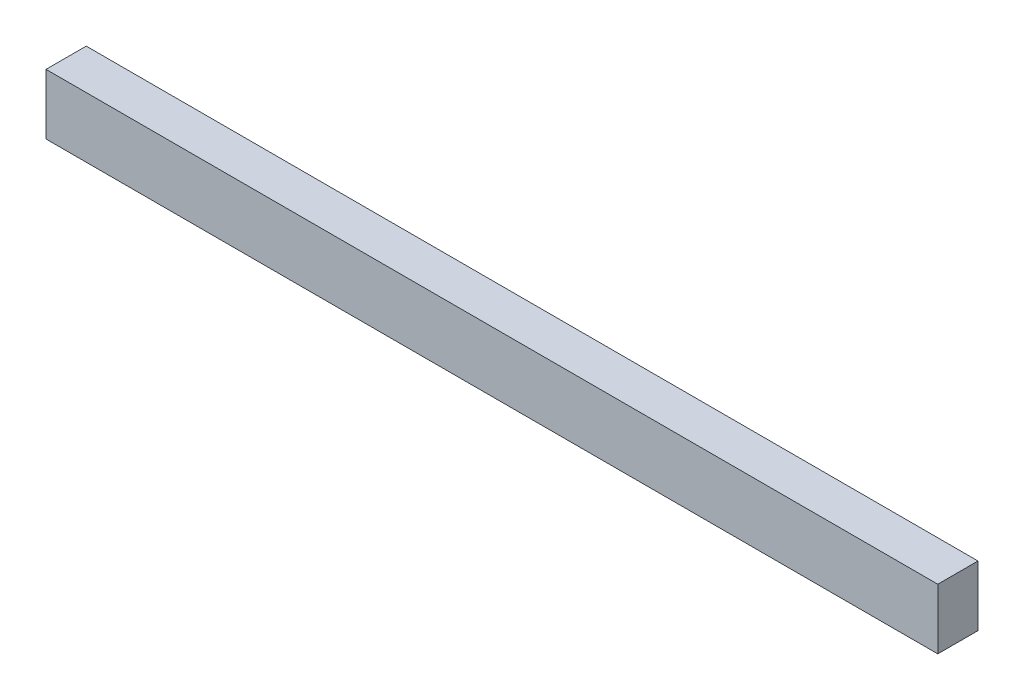
ISO-10303-21;
HEADER;
FILE_DESCRIPTION(('STEP AP214'),'2;1');
FILE_NAME('part.step','',(''),(''),'','','');
FILE_SCHEMA(('AUTOMOTIVE_DESIGN { 1 0 10303 214 1 1 1 1 }'));
ENDSEC;
DATA;
#1=APPLICATION_CONTEXT('core data for automotive mechanical design processes');
#2=APPLICATION_PROTOCOL_DEFINITION('international standard','automotive_design',2000,#1);
#3=PRODUCT_CONTEXT('',#1,'mechanical');
#4=PRODUCT('Part','Part','',(#3));
#5=PRODUCT_RELATED_PRODUCT_CATEGORY('part','',(#4));
#6=PRODUCT_DEFINITION_FORMATION('','',#4);
#7=PRODUCT_DEFINITION_CONTEXT('part definition',#1,'design');
#8=PRODUCT_DEFINITION('design','',#6,#7);
#9=PRODUCT_DEFINITION_SHAPE('','',#8);
#10=(LENGTH_UNIT() NAMED_UNIT(*) SI_UNIT(.MILLI.,.METRE.));
#11=(NAMED_UNIT(*) PLANE_ANGLE_UNIT() SI_UNIT($,.RADIAN.));
#12=(NAMED_UNIT(*) SI_UNIT($,.STERADIAN.) SOLID_ANGLE_UNIT());
#13=UNCERTAINTY_MEASURE_WITH_UNIT(LENGTH_MEASURE(1.E-05),#10,'distance_accuracy_value','');
#14=(GEOMETRIC_REPRESENTATION_CONTEXT(3) GLOBAL_UNCERTAINTY_ASSIGNED_CONTEXT((#13)) GLOBAL_UNIT_ASSIGNED_CONTEXT((#10,
#11,#12)) REPRESENTATION_CONTEXT('',''));
#15=CARTESIAN_POINT('',(0.,0.,0.));
#16=DIRECTION('',(0.,0.,1.));
#17=DIRECTION('',(1.,0.,0.));
#18=AXIS2_PLACEMENT_3D('',#15,#16,#17);
#19=CARTESIAN_POINT('',(-168.319409066419,27.,-67.9761376248613));
#20=DIRECTION('',(1.,0.,0.));
#21=DIRECTION('',(0.,0.,-1.));
#22=AXIS2_PLACEMENT_3D('',#19,#20,#21);
#23=PLANE('',#22);
#24=DIRECTION('',(0.,0.,1.));
#25=VECTOR('',#24,1.);
#26=CARTESIAN_POINT('',(-168.319409066419,0.,-67.9761376248613));
#27=LINE('',#26,#25);
#28=CARTESIAN_POINT('',(-168.319409066419,0.,-67.9761376248613));
#29=VERTEX_POINT('',#28);
#30=CARTESIAN_POINT('',(-168.319409066419,0.,-49.9761376248613));
#31=VERTEX_POINT('',#30);
#32=EDGE_CURVE('E109',#29,#31,#27,.T.);
#33=ORIENTED_EDGE('',*,*,#32,.T.);
#34=DIRECTION('',(0.,-1.,0.));
#35=VECTOR('',#34,1.);
#36=CARTESIAN_POINT('',(-168.319409066419,27.,-49.9761376248613));
#37=LINE('',#36,#35);
#38=CARTESIAN_POINT('',(-168.319409066419,27.,-49.9761376248613));
#39=VERTEX_POINT('',#38);
#40=EDGE_CURVE('E11',#39,#31,#37,.T.);
#41=ORIENTED_EDGE('',*,*,#40,.F.);
#42=DIRECTION('',(0.,0.,1.));
#43=VECTOR('',#42,1.);
#44=CARTESIAN_POINT('',(-168.319409066419,27.,-67.9761376248613));
#45=LINE('',#44,#43);
#46=CARTESIAN_POINT('',(-168.319409066419,27.,-67.9761376248613));
#47=VERTEX_POINT('',#46);
#48=EDGE_CURVE('E93',#47,#39,#45,.T.);
#49=ORIENTED_EDGE('',*,*,#48,.F.);
#50=DIRECTION('',(0.,-1.,0.));
#51=VECTOR('',#50,1.);
#52=CARTESIAN_POINT('',(-168.319409066419,27.,-67.9761376248613));
#53=LINE('',#52,#51);
#54=EDGE_CURVE('E105',#47,#29,#53,.T.);
#55=ORIENTED_EDGE('',*,*,#54,.T.);
#56=EDGE_LOOP('',(#33,#41,#49,#55));
#57=FACE_BOUND('',#56,.T.);
#58=ADVANCED_FACE('F41',(#57),#23,.F.);
#59=CARTESIAN_POINT('',(-168.319409066419,27.,-49.9761376248613));
#60=DIRECTION('',(0.,0.,-1.));
#61=DIRECTION('',(-1.,0.,0.));
#62=AXIS2_PLACEMENT_3D('',#59,#60,#61);
#63=PLANE('',#62);
#64=DIRECTION('',(1.,0.,0.));
#65=VECTOR('',#64,1.);
#66=CARTESIAN_POINT('',(-168.319409066419,0.,-49.9761376248613));
#67=LINE('',#66,#65);
#68=CARTESIAN_POINT('',(230.680590933581,0.,-49.9761376248613));
#69=VERTEX_POINT('',#68);
#70=EDGE_CURVE('E98',#31,#69,#67,.T.);
#71=ORIENTED_EDGE('',*,*,#70,.T.);
#72=DIRECTION('',(0.,-1.,0.));
#73=VECTOR('',#72,1.);
#74=CARTESIAN_POINT('',(230.680590933581,27.,-49.9761376248613));
#75=LINE('',#74,#73);
#76=CARTESIAN_POINT('',(230.680590933581,27.,-49.9761376248613));
#77=VERTEX_POINT('',#76);
#78=EDGE_CURVE('E50',#77,#69,#75,.T.);
#79=ORIENTED_EDGE('',*,*,#78,.F.);
#80=DIRECTION('',(1.,0.,0.));
#81=VECTOR('',#80,1.);
#82=CARTESIAN_POINT('',(-168.319409066419,27.,-49.9761376248613));
#83=LINE('',#82,#81);
#84=EDGE_CURVE('E88',#39,#77,#83,.T.);
#85=ORIENTED_EDGE('',*,*,#84,.F.);
#86=ORIENTED_EDGE('',*,*,#40,.T.);
#87=EDGE_LOOP('',(#71,#79,#85,#86));
#88=FACE_BOUND('',#87,.T.);
#89=ADVANCED_FACE('F97',(#88),#63,.F.);
#90=CARTESIAN_POINT('',(230.680590933581,27.,-67.9761376248613));
#91=DIRECTION('',(-1.,0.,0.));
#92=DIRECTION('',(0.,0.,1.));
#93=AXIS2_PLACEMENT_3D('',#90,#91,#92);
#94=PLANE('',#93);
#95=DIRECTION('',(0.,0.,-1.));
#96=VECTOR('',#95,1.);
#97=CARTESIAN_POINT('',(230.680590933581,0.,-67.9761376248613));
#98=LINE('',#97,#96);
#99=CARTESIAN_POINT('',(230.680590933581,0.,-67.9761376248613));
#100=VERTEX_POINT('',#99);
#101=EDGE_CURVE('E75',#69,#100,#98,.T.);
#102=ORIENTED_EDGE('',*,*,#101,.T.);
#103=DIRECTION('',(0.,-1.,0.));
#104=VECTOR('',#103,1.);
#105=CARTESIAN_POINT('',(230.680590933581,27.,-67.9761376248613));
#106=LINE('',#105,#104);
#107=CARTESIAN_POINT('',(230.680590933581,27.,-67.9761376248613));
#108=VERTEX_POINT('',#107);
#109=EDGE_CURVE('E100',#108,#100,#106,.T.);
#110=ORIENTED_EDGE('',*,*,#109,.F.);
#111=DIRECTION('',(0.,0.,-1.));
#112=VECTOR('',#111,1.);
#113=CARTESIAN_POINT('',(230.680590933581,27.,-67.9761376248613));
#114=LINE('',#113,#112);
#115=EDGE_CURVE('E91',#77,#108,#114,.T.);
#116=ORIENTED_EDGE('',*,*,#115,.F.);
#117=ORIENTED_EDGE('',*,*,#78,.T.);
#118=EDGE_LOOP('',(#102,#110,#116,#117));
#119=FACE_BOUND('',#118,.T.);
#120=ADVANCED_FACE('F101',(#119),#94,.F.);
#121=CARTESIAN_POINT('',(-168.319409066419,27.,-67.9761376248613));
#122=DIRECTION('',(0.,0.,1.));
#123=DIRECTION('',(1.,0.,0.));
#124=AXIS2_PLACEMENT_3D('',#121,#122,#123);
#125=PLANE('',#124);
#126=DIRECTION('',(-1.,0.,0.));
#127=VECTOR('',#126,1.);
#128=CARTESIAN_POINT('',(-168.319409066419,0.,-67.9761376248613));
#129=LINE('',#128,#127);
#130=EDGE_CURVE('E81',#100,#29,#129,.T.);
#131=ORIENTED_EDGE('',*,*,#130,.T.);
#132=ORIENTED_EDGE('',*,*,#54,.F.);
#133=DIRECTION('',(-1.,0.,0.));
#134=VECTOR('',#133,1.);
#135=CARTESIAN_POINT('',(-168.319409066419,27.,-67.9761376248613));
#136=LINE('',#135,#134);
#137=EDGE_CURVE('E58',#108,#47,#136,.T.);
#138=ORIENTED_EDGE('',*,*,#137,.F.);
#139=ORIENTED_EDGE('',*,*,#109,.T.);
#140=EDGE_LOOP('',(#131,#132,#138,#139));
#141=FACE_BOUND('',#140,.T.);
#142=ADVANCED_FACE('F122',(#141),#125,.F.);
#143=CARTESIAN_POINT('',(0.,27.,0.));
#144=DIRECTION('',(0.,1.,0.));
#145=DIRECTION('',(0.,0.,1.));
#146=AXIS2_PLACEMENT_3D('',#143,#144,#145);
#147=PLANE('',#146);
#148=ORIENTED_EDGE('',*,*,#48,.T.);
#149=ORIENTED_EDGE('',*,*,#84,.T.);
#150=ORIENTED_EDGE('',*,*,#115,.T.);
#151=ORIENTED_EDGE('',*,*,#137,.T.);
#152=EDGE_LOOP('',(#148,#149,#150,#151));
#153=FACE_BOUND('',#152,.T.);
#154=ADVANCED_FACE('F89',(#153),#147,.T.);
#155=CARTESIAN_POINT('',(0.,0.,0.));
#156=DIRECTION('',(0.,1.,0.));
#157=DIRECTION('',(0.,0.,1.));
#158=AXIS2_PLACEMENT_3D('',#155,#156,#157);
#159=PLANE('',#158);
#160=ORIENTED_EDGE('',*,*,#32,.F.);
#161=ORIENTED_EDGE('',*,*,#130,.F.);
#162=ORIENTED_EDGE('',*,*,#101,.F.);
#163=ORIENTED_EDGE('',*,*,#70,.F.);
#164=EDGE_LOOP('',(#160,#161,#162,#163));
#165=FACE_BOUND('',#164,.T.);
#166=ADVANCED_FACE('F125',(#165),#159,.F.);
#167=CLOSED_SHELL('',(#58,#89,#120,#142,#154,#166));
#168=MANIFOLD_SOLID_BREP('B2',#167);
#169=ADVANCED_BREP_SHAPE_REPRESENTATION('',(#18,#168),#14);
#170=SHAPE_DEFINITION_REPRESENTATION(#9,#169);
ENDSEC;
END-ISO-10303-21;
